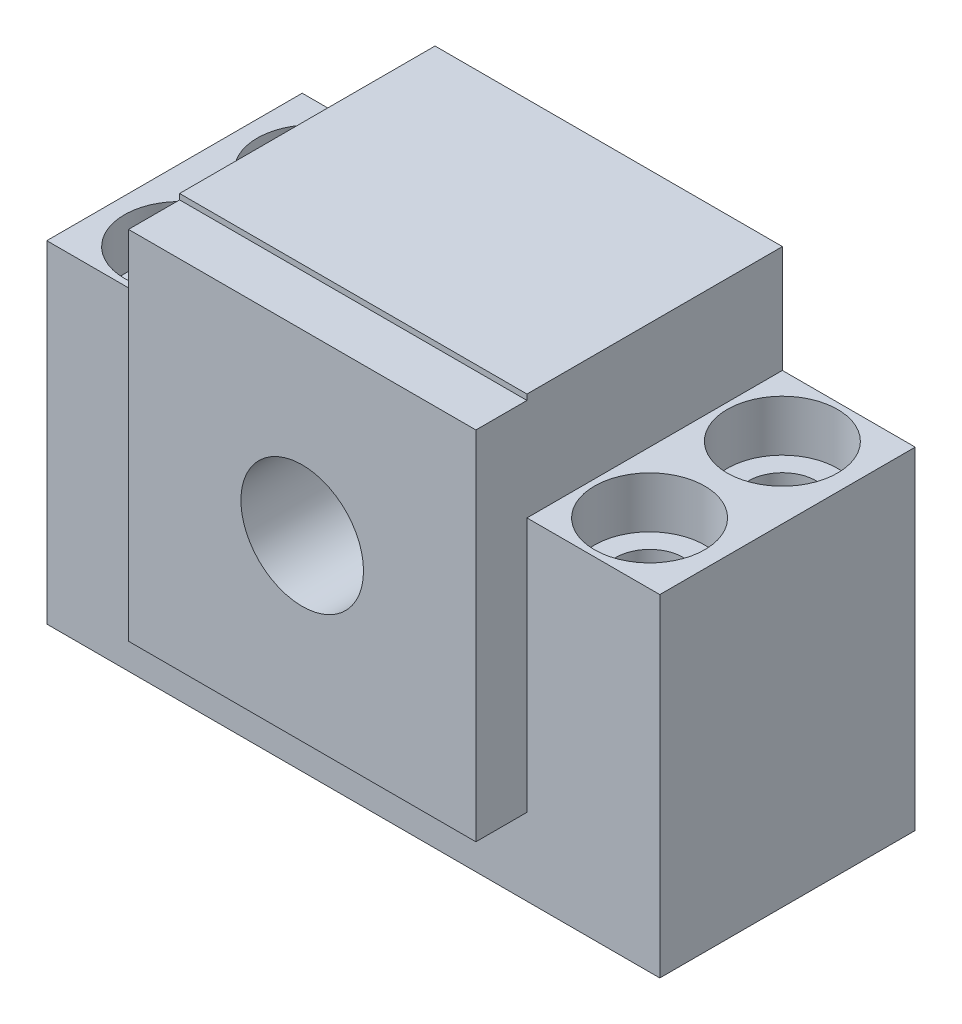
ISO-10303-21;
HEADER;
FILE_DESCRIPTION(('STEP AP214'),'2;1');
FILE_NAME('part.step','',(''),(''),'','','');
FILE_SCHEMA(('AUTOMOTIVE_DESIGN { 1 0 10303 214 1 1 1 1 }'));
ENDSEC;
DATA;
#1=APPLICATION_CONTEXT('core data for automotive mechanical design processes');
#2=APPLICATION_PROTOCOL_DEFINITION('international standard','automotive_design',2000,#1);
#3=PRODUCT_CONTEXT('',#1,'mechanical');
#4=PRODUCT('Part','Part','',(#3));
#5=PRODUCT_RELATED_PRODUCT_CATEGORY('part','',(#4));
#6=PRODUCT_DEFINITION_FORMATION('','',#4);
#7=PRODUCT_DEFINITION_CONTEXT('part definition',#1,'design');
#8=PRODUCT_DEFINITION('design','',#6,#7);
#9=PRODUCT_DEFINITION_SHAPE('','',#8);
#10=(LENGTH_UNIT() NAMED_UNIT(*) SI_UNIT(.MILLI.,.METRE.));
#11=(NAMED_UNIT(*) PLANE_ANGLE_UNIT() SI_UNIT($,.RADIAN.));
#12=(NAMED_UNIT(*) SI_UNIT($,.STERADIAN.) SOLID_ANGLE_UNIT());
#13=UNCERTAINTY_MEASURE_WITH_UNIT(LENGTH_MEASURE(1.E-05),#10,'distance_accuracy_value','');
#14=(GEOMETRIC_REPRESENTATION_CONTEXT(3) GLOBAL_UNCERTAINTY_ASSIGNED_CONTEXT((#13)) GLOBAL_UNIT_ASSIGNED_CONTEXT((#10,
#11,#12)) REPRESENTATION_CONTEXT('',''));
#15=CARTESIAN_POINT('',(0.,0.,0.));
#16=DIRECTION('',(0.,0.,1.));
#17=DIRECTION('',(1.,0.,0.));
#18=AXIS2_PLACEMENT_3D('',#15,#16,#17);
#19=CARTESIAN_POINT('',(0.,0.,25.));
#20=DIRECTION('',(0.,0.,1.));
#21=DIRECTION('',(1.,0.,0.));
#22=AXIS2_PLACEMENT_3D('',#19,#20,#21);
#23=PLANE('',#22);
#24=DIRECTION('',(-1.,0.,0.));
#25=VECTOR('',#24,1.);
#26=CARTESIAN_POINT('',(-14.8619741242739,28.5194279589268,25.));
#27=LINE('',#26,#25);
#28=CARTESIAN_POINT('',(19.1380258757261,28.5194279589268,25.));
#29=VERTEX_POINT('',#28);
#30=CARTESIAN_POINT('',(-14.8619741242739,28.5194279589268,25.));
#31=VERTEX_POINT('',#30);
#32=EDGE_CURVE('E146',#29,#31,#27,.T.);
#33=ORIENTED_EDGE('',*,*,#32,.F.);
#34=DIRECTION('',(0.,1.,0.));
#35=VECTOR('',#34,1.);
#36=CARTESIAN_POINT('',(19.1380258757261,18.5640732265446,25.));
#37=LINE('',#36,#35);
#38=CARTESIAN_POINT('',(19.1380258757261,29.0640732265446,25.));
#39=VERTEX_POINT('',#38);
#40=EDGE_CURVE('E206',#29,#39,#37,.T.);
#41=ORIENTED_EDGE('',*,*,#40,.T.);
#42=DIRECTION('',(-1.,0.,0.));
#43=VECTOR('',#42,1.);
#44=CARTESIAN_POINT('',(19.1380258757261,29.0640732265446,25.));
#45=LINE('',#44,#43);
#46=CARTESIAN_POINT('',(-14.8619741242739,29.0640732265446,25.));
#47=VERTEX_POINT('',#46);
#48=EDGE_CURVE('E208',#39,#47,#45,.T.);
#49=ORIENTED_EDGE('',*,*,#48,.T.);
#50=DIRECTION('',(0.,-1.,0.));
#51=VECTOR('',#50,1.);
#52=CARTESIAN_POINT('',(-14.8619741242739,29.0640732265446,25.));
#53=LINE('',#52,#51);
#54=EDGE_CURVE('E60',#47,#31,#53,.T.);
#55=ORIENTED_EDGE('',*,*,#54,.T.);
#56=EDGE_LOOP('',(#33,#41,#49,#55));
#57=FACE_BOUND('',#56,.T.);
#58=ADVANCED_FACE('F36',(#57),#23,.T.);
#59=CARTESIAN_POINT('',(-20.8619741242739,-13.9369267734554,6.));
#60=DIRECTION('',(0.,1.,0.));
#61=DIRECTION('',(0.,0.,1.));
#62=AXIS2_PLACEMENT_3D('',#59,#60,#61);
#63=CYLINDRICAL_SURFACE('',#62,3.3);
#64=CARTESIAN_POINT('',(-20.8619741242739,-13.9359267734554,6.));
#65=DIRECTION('',(0.,1.,0.));
#66=DIRECTION('',(0.,0.,1.));
#67=AXIS2_PLACEMENT_3D('',#64,#65,#66);
#68=CIRCLE('',#67,3.3);
#69=CARTESIAN_POINT('',(-20.8619741242739,-13.9359267734554,9.3));
#70=VERTEX_POINT('',#69);
#71=EDGE_CURVE('E180',#70,#70,#68,.F.);
#72=ORIENTED_EDGE('',*,*,#71,.T.);
#73=EDGE_LOOP('',(#72));
#74=FACE_BOUND('',#73,.T.);
#75=CARTESIAN_POINT('',(-20.8619741242739,13.5640732265446,6.));
#76=DIRECTION('',(0.,1.,0.));
#77=DIRECTION('',(0.,0.,1.));
#78=AXIS2_PLACEMENT_3D('',#75,#76,#77);
#79=CIRCLE('',#78,3.3);
#80=CARTESIAN_POINT('',(-20.8619741242739,13.5640732265446,9.3));
#81=VERTEX_POINT('',#80);
#82=EDGE_CURVE('E40',#81,#81,#79,.F.);
#83=ORIENTED_EDGE('',*,*,#82,.F.);
#84=EDGE_LOOP('',(#83));
#85=FACE_BOUND('',#84,.T.);
#86=ADVANCED_FACE('F264',(#74,#85),#63,.F.);
#87=CARTESIAN_POINT('',(-20.8619741242739,-13.9369267734554,19.));
#88=DIRECTION('',(0.,1.,0.));
#89=DIRECTION('',(0.,0.,1.));
#90=AXIS2_PLACEMENT_3D('',#87,#88,#89);
#91=CYLINDRICAL_SURFACE('',#90,3.3);
#92=CARTESIAN_POINT('',(-20.8619741242739,-13.9359267734554,19.));
#93=DIRECTION('',(0.,1.,0.));
#94=DIRECTION('',(0.,0.,1.));
#95=AXIS2_PLACEMENT_3D('',#92,#93,#94);
#96=CIRCLE('',#95,3.3);
#97=CARTESIAN_POINT('',(-20.8619741242739,-13.9359267734554,22.3));
#98=VERTEX_POINT('',#97);
#99=EDGE_CURVE('E183',#98,#98,#96,.F.);
#100=ORIENTED_EDGE('',*,*,#99,.T.);
#101=EDGE_LOOP('',(#100));
#102=FACE_BOUND('',#101,.T.);
#103=CARTESIAN_POINT('',(-20.8619741242739,13.5640732265446,19.));
#104=DIRECTION('',(0.,1.,0.));
#105=DIRECTION('',(0.,0.,1.));
#106=AXIS2_PLACEMENT_3D('',#103,#104,#105);
#107=CIRCLE('',#106,3.3);
#108=CARTESIAN_POINT('',(-20.8619741242739,13.5640732265446,22.3));
#109=VERTEX_POINT('',#108);
#110=EDGE_CURVE('E255',#109,#109,#107,.F.);
#111=ORIENTED_EDGE('',*,*,#110,.F.);
#112=EDGE_LOOP('',(#111));
#113=FACE_BOUND('',#112,.T.);
#114=ADVANCED_FACE('F266',(#102,#113),#91,.F.);
#115=CARTESIAN_POINT('',(25.1380258757261,-13.9369267734554,19.));
#116=DIRECTION('',(0.,1.,0.));
#117=DIRECTION('',(0.,0.,1.));
#118=AXIS2_PLACEMENT_3D('',#115,#116,#117);
#119=CYLINDRICAL_SURFACE('',#118,3.3);
#120=CARTESIAN_POINT('',(25.1380258757261,-13.9359267734554,19.));
#121=DIRECTION('',(0.,1.,0.));
#122=DIRECTION('',(0.,0.,1.));
#123=AXIS2_PLACEMENT_3D('',#120,#121,#122);
#124=CIRCLE('',#123,3.3);
#125=CARTESIAN_POINT('',(25.1380258757261,-13.9359267734554,22.3));
#126=VERTEX_POINT('',#125);
#127=EDGE_CURVE('E187',#126,#126,#124,.F.);
#128=ORIENTED_EDGE('',*,*,#127,.T.);
#129=EDGE_LOOP('',(#128));
#130=FACE_BOUND('',#129,.T.);
#131=CARTESIAN_POINT('',(25.1380258757261,13.5640732265446,19.));
#132=DIRECTION('',(0.,1.,0.));
#133=DIRECTION('',(0.,0.,1.));
#134=AXIS2_PLACEMENT_3D('',#131,#132,#133);
#135=CIRCLE('',#134,3.3);
#136=CARTESIAN_POINT('',(25.1380258757261,13.5640732265446,22.3));
#137=VERTEX_POINT('',#136);
#138=EDGE_CURVE('E253',#137,#137,#135,.F.);
#139=ORIENTED_EDGE('',*,*,#138,.F.);
#140=EDGE_LOOP('',(#139));
#141=FACE_BOUND('',#140,.T.);
#142=ADVANCED_FACE('F273',(#130,#141),#119,.F.);
#143=CARTESIAN_POINT('',(25.1380258757261,-13.9369267734554,6.));
#144=DIRECTION('',(0.,1.,0.));
#145=DIRECTION('',(0.,0.,1.));
#146=AXIS2_PLACEMENT_3D('',#143,#144,#145);
#147=CYLINDRICAL_SURFACE('',#146,3.3);
#148=CARTESIAN_POINT('',(25.1380258757261,-13.9359267734554,6.));
#149=DIRECTION('',(0.,1.,0.));
#150=DIRECTION('',(0.,0.,1.));
#151=AXIS2_PLACEMENT_3D('',#148,#149,#150);
#152=CIRCLE('',#151,3.3);
#153=CARTESIAN_POINT('',(25.1380258757261,-13.9359267734554,9.3));
#154=VERTEX_POINT('',#153);
#155=EDGE_CURVE('E184',#154,#154,#152,.F.);
#156=ORIENTED_EDGE('',*,*,#155,.T.);
#157=EDGE_LOOP('',(#156));
#158=FACE_BOUND('',#157,.T.);
#159=CARTESIAN_POINT('',(25.1380258757261,13.5640732265446,6.));
#160=DIRECTION('',(0.,1.,0.));
#161=DIRECTION('',(0.,0.,1.));
#162=AXIS2_PLACEMENT_3D('',#159,#160,#161);
#163=CIRCLE('',#162,3.3);
#164=CARTESIAN_POINT('',(25.1380258757261,13.5640732265446,9.3));
#165=VERTEX_POINT('',#164);
#166=EDGE_CURVE('E177',#165,#165,#163,.F.);
#167=ORIENTED_EDGE('',*,*,#166,.F.);
#168=EDGE_LOOP('',(#167));
#169=FACE_BOUND('',#168,.T.);
#170=ADVANCED_FACE('F282',(#158,#169),#147,.F.);
#171=DIRECTION('',(0.,-1.,0.));
#172=VECTOR('',#171,1.);
#173=CARTESIAN_POINT('',(-14.8619741242739,28.5194279589268,25.));
#174=LINE('',#173,#172);
#175=CARTESIAN_POINT('',(-14.8619741242739,18.5640732265446,25.));
#176=VERTEX_POINT('',#175);
#177=CARTESIAN_POINT('',(-14.8619741242739,-6.39128150583759,25.));
#178=VERTEX_POINT('',#177);
#179=EDGE_CURVE('E11',#176,#178,#174,.T.);
#180=ORIENTED_EDGE('',*,*,#179,.F.);
#181=DIRECTION('',(-1.,0.,0.));
#182=VECTOR('',#181,1.);
#183=CARTESIAN_POINT('',(-14.8619741242739,18.5640732265446,25.));
#184=LINE('',#183,#182);
#185=CARTESIAN_POINT('',(-27.8619741242739,18.5640732265446,25.));
#186=VERTEX_POINT('',#185);
#187=EDGE_CURVE('E211',#176,#186,#184,.T.);
#188=ORIENTED_EDGE('',*,*,#187,.T.);
#189=DIRECTION('',(0.,-1.,0.));
#190=VECTOR('',#189,1.);
#191=CARTESIAN_POINT('',(-27.8619741242739,18.5640732265446,25.));
#192=LINE('',#191,#190);
#193=CARTESIAN_POINT('',(-27.8619741242739,-13.9359267734554,25.));
#194=VERTEX_POINT('',#193);
#195=EDGE_CURVE('E196',#186,#194,#192,.T.);
#196=ORIENTED_EDGE('',*,*,#195,.T.);
#197=DIRECTION('',(1.,0.,0.));
#198=VECTOR('',#197,1.);
#199=CARTESIAN_POINT('',(-27.8619741242739,-13.9359267734554,25.));
#200=LINE('',#199,#198);
#201=CARTESIAN_POINT('',(32.1380258757261,-13.9359267734554,25.));
#202=VERTEX_POINT('',#201);
#203=EDGE_CURVE('E199',#194,#202,#200,.T.);
#204=ORIENTED_EDGE('',*,*,#203,.T.);
#205=DIRECTION('',(0.,1.,0.));
#206=VECTOR('',#205,1.);
#207=CARTESIAN_POINT('',(32.1380258757261,-13.9359267734554,25.));
#208=LINE('',#207,#206);
#209=CARTESIAN_POINT('',(32.1380258757261,18.5640732265446,25.));
#210=VERTEX_POINT('',#209);
#211=EDGE_CURVE('E202',#202,#210,#208,.T.);
#212=ORIENTED_EDGE('',*,*,#211,.T.);
#213=DIRECTION('',(-1.,0.,0.));
#214=VECTOR('',#213,1.);
#215=CARTESIAN_POINT('',(32.1380258757261,18.5640732265446,25.));
#216=LINE('',#215,#214);
#217=CARTESIAN_POINT('',(19.1380258757261,18.5640732265446,25.));
#218=VERTEX_POINT('',#217);
#219=EDGE_CURVE('E204',#210,#218,#216,.T.);
#220=ORIENTED_EDGE('',*,*,#219,.T.);
#221=DIRECTION('',(0.,1.,0.));
#222=VECTOR('',#221,1.);
#223=CARTESIAN_POINT('',(19.1380258757261,28.5194279589268,25.));
#224=LINE('',#223,#222);
#225=CARTESIAN_POINT('',(19.1380258757261,-6.39128150583759,25.));
#226=VERTEX_POINT('',#225);
#227=EDGE_CURVE('E350',#226,#218,#224,.T.);
#228=ORIENTED_EDGE('',*,*,#227,.F.);
#229=DIRECTION('',(1.,0.,0.));
#230=VECTOR('',#229,1.);
#231=CARTESIAN_POINT('',(-14.8619741242739,-6.39128150583759,25.));
#232=LINE('',#231,#230);
#233=EDGE_CURVE('E53',#178,#226,#232,.T.);
#234=ORIENTED_EDGE('',*,*,#233,.F.);
#235=EDGE_LOOP('',(#180,#188,#196,#204,#212,#220,#228,#234));
#236=FACE_BOUND('',#235,.T.);
#237=ADVANCED_FACE('F277',(#236),#23,.T.);
#238=CARTESIAN_POINT('',(0.,0.,0.));
#239=DIRECTION('',(0.,0.,1.));
#240=DIRECTION('',(1.,0.,0.));
#241=AXIS2_PLACEMENT_3D('',#238,#239,#240);
#242=PLANE('',#241);
#243=DIRECTION('',(0.,-1.,0.));
#244=VECTOR('',#243,1.);
#245=CARTESIAN_POINT('',(-27.8619741242739,18.5640732265446,0.));
#246=LINE('',#245,#244);
#247=CARTESIAN_POINT('',(-27.8619741242739,18.5640732265446,0.));
#248=VERTEX_POINT('',#247);
#249=CARTESIAN_POINT('',(-27.8619741242739,-13.9359267734554,0.));
#250=VERTEX_POINT('',#249);
#251=EDGE_CURVE('E195',#248,#250,#246,.T.);
#252=ORIENTED_EDGE('',*,*,#251,.F.);
#253=DIRECTION('',(-1.,0.,0.));
#254=VECTOR('',#253,1.);
#255=CARTESIAN_POINT('',(-14.8619741242739,18.5640732265446,0.));
#256=LINE('',#255,#254);
#257=CARTESIAN_POINT('',(-14.8619741242739,18.5640732265446,0.));
#258=VERTEX_POINT('',#257);
#259=EDGE_CURVE('E200',#258,#248,#256,.T.);
#260=ORIENTED_EDGE('',*,*,#259,.F.);
#261=DIRECTION('',(0.,-1.,0.));
#262=VECTOR('',#261,1.);
#263=CARTESIAN_POINT('',(-14.8619741242739,29.0640732265446,0.));
#264=LINE('',#263,#262);
#265=CARTESIAN_POINT('',(-14.8619741242739,29.0640732265446,0.));
#266=VERTEX_POINT('',#265);
#267=EDGE_CURVE('E226',#266,#258,#264,.T.);
#268=ORIENTED_EDGE('',*,*,#267,.F.);
#269=DIRECTION('',(-1.,0.,0.));
#270=VECTOR('',#269,1.);
#271=CARTESIAN_POINT('',(19.1380258757261,29.0640732265446,0.));
#272=LINE('',#271,#270);
#273=CARTESIAN_POINT('',(19.1380258757261,29.0640732265446,0.));
#274=VERTEX_POINT('',#273);
#275=EDGE_CURVE('E224',#274,#266,#272,.T.);
#276=ORIENTED_EDGE('',*,*,#275,.F.);
#277=DIRECTION('',(0.,1.,0.));
#278=VECTOR('',#277,1.);
#279=CARTESIAN_POINT('',(19.1380258757261,18.5640732265446,0.));
#280=LINE('',#279,#278);
#281=CARTESIAN_POINT('',(19.1380258757261,18.5640732265446,0.));
#282=VERTEX_POINT('',#281);
#283=EDGE_CURVE('E222',#282,#274,#280,.T.);
#284=ORIENTED_EDGE('',*,*,#283,.F.);
#285=DIRECTION('',(-1.,0.,0.));
#286=VECTOR('',#285,1.);
#287=CARTESIAN_POINT('',(32.1380258757261,18.5640732265446,0.));
#288=LINE('',#287,#286);
#289=CARTESIAN_POINT('',(32.1380258757261,18.5640732265446,0.));
#290=VERTEX_POINT('',#289);
#291=EDGE_CURVE('E220',#290,#282,#288,.T.);
#292=ORIENTED_EDGE('',*,*,#291,.F.);
#293=DIRECTION('',(0.,1.,0.));
#294=VECTOR('',#293,1.);
#295=CARTESIAN_POINT('',(32.1380258757261,-13.9359267734554,0.));
#296=LINE('',#295,#294);
#297=CARTESIAN_POINT('',(32.1380258757261,-13.9359267734554,0.));
#298=VERTEX_POINT('',#297);
#299=EDGE_CURVE('E218',#298,#290,#296,.T.);
#300=ORIENTED_EDGE('',*,*,#299,.F.);
#301=DIRECTION('',(1.,0.,0.));
#302=VECTOR('',#301,1.);
#303=CARTESIAN_POINT('',(-27.8619741242739,-13.9359267734554,0.));
#304=LINE('',#303,#302);
#305=EDGE_CURVE('E216',#250,#298,#304,.T.);
#306=ORIENTED_EDGE('',*,*,#305,.F.);
#307=EDGE_LOOP('',(#252,#260,#268,#276,#284,#292,#300,#306));
#308=FACE_BOUND('',#307,.T.);
#309=CARTESIAN_POINT('',(2.13802587572613,11.0640732265446,0.));
#310=DIRECTION('',(0.,0.,1.));
#311=DIRECTION('',(1.,0.,0.));
#312=AXIS2_PLACEMENT_3D('',#309,#310,#311);
#313=CIRCLE('',#312,6.);
#314=CARTESIAN_POINT('',(8.13802587572613,11.0640732265446,0.));
#315=VERTEX_POINT('',#314);
#316=EDGE_CURVE('E192',#315,#315,#313,.T.);
#317=ORIENTED_EDGE('',*,*,#316,.T.);
#318=EDGE_LOOP('',(#317));
#319=FACE_BOUND('',#318,.T.);
#320=ADVANCED_FACE('F296',(#308,#319),#242,.F.);
#321=CARTESIAN_POINT('',(-27.8619741242739,18.5640732265446,25.));
#322=DIRECTION('',(1.,0.,0.));
#323=DIRECTION('',(0.,0.,-1.));
#324=AXIS2_PLACEMENT_3D('',#321,#322,#323);
#325=PLANE('',#324);
#326=ORIENTED_EDGE('',*,*,#251,.T.);
#327=DIRECTION('',(0.,0.,-1.));
#328=VECTOR('',#327,1.);
#329=CARTESIAN_POINT('',(-27.8619741242739,-13.9359267734554,25.));
#330=LINE('',#329,#328);
#331=EDGE_CURVE('E45',#194,#250,#330,.T.);
#332=ORIENTED_EDGE('',*,*,#331,.F.);
#333=ORIENTED_EDGE('',*,*,#195,.F.);
#334=DIRECTION('',(0.,0.,-1.));
#335=VECTOR('',#334,1.);
#336=CARTESIAN_POINT('',(-27.8619741242739,18.5640732265446,25.));
#337=LINE('',#336,#335);
#338=EDGE_CURVE('E213',#186,#248,#337,.T.);
#339=ORIENTED_EDGE('',*,*,#338,.T.);
#340=EDGE_LOOP('',(#326,#332,#333,#339));
#341=FACE_BOUND('',#340,.T.);
#342=ADVANCED_FACE('F38',(#341),#325,.F.);
#343=CARTESIAN_POINT('',(-27.8619741242739,-13.9359267734554,25.));
#344=DIRECTION('',(0.,1.,0.));
#345=DIRECTION('',(0.,0.,1.));
#346=AXIS2_PLACEMENT_3D('',#343,#344,#345);
#347=PLANE('',#346);
#348=ORIENTED_EDGE('',*,*,#155,.F.);
#349=EDGE_LOOP('',(#348));
#350=FACE_BOUND('',#349,.T.);
#351=ORIENTED_EDGE('',*,*,#99,.F.);
#352=EDGE_LOOP('',(#351));
#353=FACE_BOUND('',#352,.T.);
#354=ORIENTED_EDGE('',*,*,#71,.F.);
#355=EDGE_LOOP('',(#354));
#356=FACE_BOUND('',#355,.T.);
#357=ORIENTED_EDGE('',*,*,#127,.F.);
#358=EDGE_LOOP('',(#357));
#359=FACE_BOUND('',#358,.T.);
#360=ORIENTED_EDGE('',*,*,#305,.T.);
#361=DIRECTION('',(0.,0.,-1.));
#362=VECTOR('',#361,1.);
#363=CARTESIAN_POINT('',(32.1380258757261,-13.9359267734554,25.));
#364=LINE('',#363,#362);
#365=EDGE_CURVE('E246',#202,#298,#364,.T.);
#366=ORIENTED_EDGE('',*,*,#365,.F.);
#367=ORIENTED_EDGE('',*,*,#203,.F.);
#368=ORIENTED_EDGE('',*,*,#331,.T.);
#369=EDGE_LOOP('',(#360,#366,#367,#368));
#370=FACE_BOUND('',#369,.T.);
#371=ADVANCED_FACE('F319',(#350,#353,#356,#359,#370),#347,.F.);
#372=CARTESIAN_POINT('',(32.1380258757261,-13.9359267734554,25.));
#373=DIRECTION('',(-1.,0.,0.));
#374=DIRECTION('',(0.,0.,1.));
#375=AXIS2_PLACEMENT_3D('',#372,#373,#374);
#376=PLANE('',#375);
#377=ORIENTED_EDGE('',*,*,#299,.T.);
#378=DIRECTION('',(0.,0.,-1.));
#379=VECTOR('',#378,1.);
#380=CARTESIAN_POINT('',(32.1380258757261,18.5640732265446,25.));
#381=LINE('',#380,#379);
#382=EDGE_CURVE('E243',#210,#290,#381,.T.);
#383=ORIENTED_EDGE('',*,*,#382,.F.);
#384=ORIENTED_EDGE('',*,*,#211,.F.);
#385=ORIENTED_EDGE('',*,*,#365,.T.);
#386=EDGE_LOOP('',(#377,#383,#384,#385));
#387=FACE_BOUND('',#386,.T.);
#388=ADVANCED_FACE('F316',(#387),#376,.F.);
#389=CARTESIAN_POINT('',(32.1380258757261,18.5640732265446,25.));
#390=DIRECTION('',(0.,-1.,0.));
#391=DIRECTION('',(0.,0.,-1.));
#392=AXIS2_PLACEMENT_3D('',#389,#390,#391);
#393=PLANE('',#392);
#394=CARTESIAN_POINT('',(25.1380258757261,18.5640732265446,6.));
#395=DIRECTION('',(0.,1.,0.));
#396=DIRECTION('',(0.,0.,1.));
#397=AXIS2_PLACEMENT_3D('',#394,#395,#396);
#398=CIRCLE('',#397,5.4);
#399=CARTESIAN_POINT('',(25.1380258757261,18.5640732265446,11.4));
#400=VERTEX_POINT('',#399);
#401=EDGE_CURVE('E163',#400,#400,#398,.T.);
#402=ORIENTED_EDGE('',*,*,#401,.F.);
#403=EDGE_LOOP('',(#402));
#404=FACE_BOUND('',#403,.T.);
#405=CARTESIAN_POINT('',(25.1380258757261,18.5640732265446,19.));
#406=DIRECTION('',(0.,1.,0.));
#407=DIRECTION('',(0.,0.,1.));
#408=AXIS2_PLACEMENT_3D('',#405,#406,#407);
#409=CIRCLE('',#408,5.4);
#410=CARTESIAN_POINT('',(25.1380258757261,18.5640732265446,24.4));
#411=VERTEX_POINT('',#410);
#412=EDGE_CURVE('E162',#411,#411,#409,.T.);
#413=ORIENTED_EDGE('',*,*,#412,.F.);
#414=EDGE_LOOP('',(#413));
#415=FACE_BOUND('',#414,.T.);
#416=ORIENTED_EDGE('',*,*,#291,.T.);
#417=DIRECTION('',(0.,0.,-1.));
#418=VECTOR('',#417,1.);
#419=CARTESIAN_POINT('',(19.1380258757261,18.5640732265446,25.));
#420=LINE('',#419,#418);
#421=EDGE_CURVE('E240',#218,#282,#420,.T.);
#422=ORIENTED_EDGE('',*,*,#421,.F.);
#423=ORIENTED_EDGE('',*,*,#219,.F.);
#424=ORIENTED_EDGE('',*,*,#382,.T.);
#425=EDGE_LOOP('',(#416,#422,#423,#424));
#426=FACE_BOUND('',#425,.T.);
#427=ADVANCED_FACE('F312',(#404,#415,#426),#393,.F.);
#428=CARTESIAN_POINT('',(19.1380258757261,18.5640732265446,25.));
#429=DIRECTION('',(-1.,0.,0.));
#430=DIRECTION('',(0.,0.,1.));
#431=AXIS2_PLACEMENT_3D('',#428,#429,#430);
#432=PLANE('',#431);
#433=ORIENTED_EDGE('',*,*,#283,.T.);
#434=DIRECTION('',(0.,0.,-1.));
#435=VECTOR('',#434,1.);
#436=CARTESIAN_POINT('',(19.1380258757261,29.0640732265446,25.));
#437=LINE('',#436,#435);
#438=EDGE_CURVE('E237',#39,#274,#437,.T.);
#439=ORIENTED_EDGE('',*,*,#438,.F.);
#440=ORIENTED_EDGE('',*,*,#40,.F.);
#441=DIRECTION('',(0.,0.,-1.));
#442=VECTOR('',#441,1.);
#443=CARTESIAN_POINT('',(19.1380258757261,28.5194279589268,30.));
#444=LINE('',#443,#442);
#445=CARTESIAN_POINT('',(19.1380258757261,28.5194279589268,30.));
#446=VERTEX_POINT('',#445);
#447=EDGE_CURVE('E155',#446,#29,#444,.T.);
#448=ORIENTED_EDGE('',*,*,#447,.F.);
#449=DIRECTION('',(0.,1.,0.));
#450=VECTOR('',#449,1.);
#451=CARTESIAN_POINT('',(19.1380258757261,28.5194279589268,30.));
#452=LINE('',#451,#450);
#453=CARTESIAN_POINT('',(19.1380258757261,-6.39128150583759,30.));
#454=VERTEX_POINT('',#453);
#455=EDGE_CURVE('E135',#454,#446,#452,.T.);
#456=ORIENTED_EDGE('',*,*,#455,.F.);
#457=DIRECTION('',(0.,0.,-1.));
#458=VECTOR('',#457,1.);
#459=CARTESIAN_POINT('',(19.1380258757261,-6.39128150583759,30.));
#460=LINE('',#459,#458);
#461=EDGE_CURVE('E132',#454,#226,#460,.T.);
#462=ORIENTED_EDGE('',*,*,#461,.T.);
#463=ORIENTED_EDGE('',*,*,#227,.T.);
#464=ORIENTED_EDGE('',*,*,#421,.T.);
#465=EDGE_LOOP('',(#433,#439,#440,#448,#456,#462,#463,#464));
#466=FACE_BOUND('',#465,.T.);
#467=ADVANCED_FACE('F308',(#466),#432,.F.);
#468=CARTESIAN_POINT('',(19.1380258757261,29.0640732265446,25.));
#469=DIRECTION('',(0.,-1.,0.));
#470=DIRECTION('',(0.,0.,-1.));
#471=AXIS2_PLACEMENT_3D('',#468,#469,#470);
#472=PLANE('',#471);
#473=ORIENTED_EDGE('',*,*,#275,.T.);
#474=DIRECTION('',(0.,0.,-1.));
#475=VECTOR('',#474,1.);
#476=CARTESIAN_POINT('',(-14.8619741242739,29.0640732265446,25.));
#477=LINE('',#476,#475);
#478=EDGE_CURVE('E234',#47,#266,#477,.T.);
#479=ORIENTED_EDGE('',*,*,#478,.F.);
#480=ORIENTED_EDGE('',*,*,#48,.F.);
#481=ORIENTED_EDGE('',*,*,#438,.T.);
#482=EDGE_LOOP('',(#473,#479,#480,#481));
#483=FACE_BOUND('',#482,.T.);
#484=ADVANCED_FACE('F305',(#483),#472,.F.);
#485=CARTESIAN_POINT('',(-14.8619741242739,29.0640732265446,25.));
#486=DIRECTION('',(1.,0.,0.));
#487=DIRECTION('',(0.,1.,0.));
#488=AXIS2_PLACEMENT_3D('',#485,#486,#487);
#489=PLANE('',#488);
#490=ORIENTED_EDGE('',*,*,#267,.T.);
#491=DIRECTION('',(0.,0.,-1.));
#492=VECTOR('',#491,1.);
#493=CARTESIAN_POINT('',(-14.8619741242739,18.5640732265446,25.));
#494=LINE('',#493,#492);
#495=EDGE_CURVE('E231',#176,#258,#494,.T.);
#496=ORIENTED_EDGE('',*,*,#495,.F.);
#497=ORIENTED_EDGE('',*,*,#179,.T.);
#498=DIRECTION('',(0.,0.,-1.));
#499=VECTOR('',#498,1.);
#500=CARTESIAN_POINT('',(-14.8619741242739,-6.39128150583759,30.));
#501=LINE('',#500,#499);
#502=CARTESIAN_POINT('',(-14.8619741242739,-6.39128150583759,30.));
#503=VERTEX_POINT('',#502);
#504=EDGE_CURVE('E130',#503,#178,#501,.T.);
#505=ORIENTED_EDGE('',*,*,#504,.F.);
#506=DIRECTION('',(0.,-1.,0.));
#507=VECTOR('',#506,1.);
#508=CARTESIAN_POINT('',(-14.8619741242739,28.5194279589268,30.));
#509=LINE('',#508,#507);
#510=CARTESIAN_POINT('',(-14.8619741242739,28.5194279589268,30.));
#511=VERTEX_POINT('',#510);
#512=EDGE_CURVE('E136',#511,#503,#509,.T.);
#513=ORIENTED_EDGE('',*,*,#512,.F.);
#514=DIRECTION('',(0.,0.,-1.));
#515=VECTOR('',#514,1.);
#516=CARTESIAN_POINT('',(-14.8619741242739,28.5194279589268,30.));
#517=LINE('',#516,#515);
#518=EDGE_CURVE('E356',#511,#31,#517,.T.);
#519=ORIENTED_EDGE('',*,*,#518,.T.);
#520=ORIENTED_EDGE('',*,*,#54,.F.);
#521=ORIENTED_EDGE('',*,*,#478,.T.);
#522=EDGE_LOOP('',(#490,#496,#497,#505,#513,#519,#520,#521));
#523=FACE_BOUND('',#522,.T.);
#524=ADVANCED_FACE('F148',(#523),#489,.F.);
#525=CARTESIAN_POINT('',(-14.8619741242739,18.5640732265446,25.));
#526=DIRECTION('',(0.,-1.,0.));
#527=DIRECTION('',(0.,0.,-1.));
#528=AXIS2_PLACEMENT_3D('',#525,#526,#527);
#529=PLANE('',#528);
#530=CARTESIAN_POINT('',(-20.8619741242739,18.5640732265446,19.));
#531=DIRECTION('',(0.,1.,0.));
#532=DIRECTION('',(0.,0.,1.));
#533=AXIS2_PLACEMENT_3D('',#530,#531,#532);
#534=CIRCLE('',#533,5.4);
#535=CARTESIAN_POINT('',(-20.8619741242739,18.5640732265446,24.4));
#536=VERTEX_POINT('',#535);
#537=EDGE_CURVE('E150',#536,#536,#534,.T.);
#538=ORIENTED_EDGE('',*,*,#537,.F.);
#539=EDGE_LOOP('',(#538));
#540=FACE_BOUND('',#539,.T.);
#541=CARTESIAN_POINT('',(-20.8619741242739,18.5640732265446,6.));
#542=DIRECTION('',(0.,1.,0.));
#543=DIRECTION('',(0.,0.,1.));
#544=AXIS2_PLACEMENT_3D('',#541,#542,#543);
#545=CIRCLE('',#544,5.4);
#546=CARTESIAN_POINT('',(-20.8619741242739,18.5640732265446,11.4));
#547=VERTEX_POINT('',#546);
#548=EDGE_CURVE('E169',#547,#547,#545,.T.);
#549=ORIENTED_EDGE('',*,*,#548,.F.);
#550=EDGE_LOOP('',(#549));
#551=FACE_BOUND('',#550,.T.);
#552=ORIENTED_EDGE('',*,*,#259,.T.);
#553=ORIENTED_EDGE('',*,*,#338,.F.);
#554=ORIENTED_EDGE('',*,*,#187,.F.);
#555=ORIENTED_EDGE('',*,*,#495,.T.);
#556=EDGE_LOOP('',(#552,#553,#554,#555));
#557=FACE_BOUND('',#556,.T.);
#558=ADVANCED_FACE('F292',(#540,#551,#557),#529,.F.);
#559=CARTESIAN_POINT('',(2.13802587572613,11.0640732265446,25.));
#560=DIRECTION('',(0.,0.,-1.));
#561=DIRECTION('',(-1.,0.,0.));
#562=AXIS2_PLACEMENT_3D('',#559,#560,#561);
#563=CYLINDRICAL_SURFACE('',#562,6.);
#564=ORIENTED_EDGE('',*,*,#316,.F.);
#565=EDGE_LOOP('',(#564));
#566=FACE_BOUND('',#565,.T.);
#567=CARTESIAN_POINT('',(2.13802587572613,11.0640732265446,30.));
#568=DIRECTION('',(0.,0.,1.));
#569=DIRECTION('',(1.,0.,0.));
#570=AXIS2_PLACEMENT_3D('',#567,#568,#569);
#571=CIRCLE('',#570,6.);
#572=CARTESIAN_POINT('',(8.13802587572613,11.0640732265446,30.));
#573=VERTEX_POINT('',#572);
#574=EDGE_CURVE('E353',#573,#573,#571,.T.);
#575=ORIENTED_EDGE('',*,*,#574,.T.);
#576=EDGE_LOOP('',(#575));
#577=FACE_BOUND('',#576,.T.);
#578=ADVANCED_FACE('F289',(#566,#577),#563,.F.);
#579=CARTESIAN_POINT('',(25.1380258757261,13.5640732265446,6.));
#580=DIRECTION('',(0.,1.,0.));
#581=DIRECTION('',(0.,0.,1.));
#582=AXIS2_PLACEMENT_3D('',#579,#580,#581);
#583=PLANE('',#582);
#584=CARTESIAN_POINT('',(25.1380258757261,13.5640732265446,6.));
#585=DIRECTION('',(0.,1.,0.));
#586=DIRECTION('',(0.,0.,1.));
#587=AXIS2_PLACEMENT_3D('',#584,#585,#586);
#588=CIRCLE('',#587,5.4);
#589=CARTESIAN_POINT('',(25.1380258757261,13.5640732265446,11.4));
#590=VERTEX_POINT('',#589);
#591=EDGE_CURVE('E159',#590,#590,#588,.T.);
#592=ORIENTED_EDGE('',*,*,#591,.T.);
#593=EDGE_LOOP('',(#592));
#594=FACE_BOUND('',#593,.T.);
#595=ORIENTED_EDGE('',*,*,#166,.T.);
#596=EDGE_LOOP('',(#595));
#597=FACE_BOUND('',#596,.T.);
#598=ADVANCED_FACE('F291',(#594,#597),#583,.T.);
#599=CARTESIAN_POINT('',(25.1380258757261,13.5640732265446,6.));
#600=DIRECTION('',(0.,1.,0.));
#601=DIRECTION('',(0.,0.,1.));
#602=AXIS2_PLACEMENT_3D('',#599,#600,#601);
#603=CYLINDRICAL_SURFACE('',#602,5.4);
#604=ORIENTED_EDGE('',*,*,#591,.F.);
#605=EDGE_LOOP('',(#604));
#606=FACE_BOUND('',#605,.T.);
#607=ORIENTED_EDGE('',*,*,#401,.T.);
#608=EDGE_LOOP('',(#607));
#609=FACE_BOUND('',#608,.T.);
#610=ADVANCED_FACE('F391',(#606,#609),#603,.F.);
#611=CARTESIAN_POINT('',(25.1380258757261,13.5640732265446,19.));
#612=DIRECTION('',(0.,1.,0.));
#613=DIRECTION('',(0.,0.,1.));
#614=AXIS2_PLACEMENT_3D('',#611,#612,#613);
#615=PLANE('',#614);
#616=CARTESIAN_POINT('',(25.1380258757261,13.5640732265446,19.));
#617=DIRECTION('',(0.,1.,0.));
#618=DIRECTION('',(0.,0.,1.));
#619=AXIS2_PLACEMENT_3D('',#616,#617,#618);
#620=CIRCLE('',#619,5.4);
#621=CARTESIAN_POINT('',(25.1380258757261,13.5640732265446,24.4));
#622=VERTEX_POINT('',#621);
#623=EDGE_CURVE('E174',#622,#622,#620,.T.);
#624=ORIENTED_EDGE('',*,*,#623,.T.);
#625=EDGE_LOOP('',(#624));
#626=FACE_BOUND('',#625,.T.);
#627=ORIENTED_EDGE('',*,*,#138,.T.);
#628=EDGE_LOOP('',(#627));
#629=FACE_BOUND('',#628,.T.);
#630=ADVANCED_FACE('F395',(#626,#629),#615,.T.);
#631=CARTESIAN_POINT('',(25.1380258757261,13.5640732265446,19.));
#632=DIRECTION('',(0.,1.,0.));
#633=DIRECTION('',(0.,0.,1.));
#634=AXIS2_PLACEMENT_3D('',#631,#632,#633);
#635=CYLINDRICAL_SURFACE('',#634,5.4);
#636=ORIENTED_EDGE('',*,*,#623,.F.);
#637=EDGE_LOOP('',(#636));
#638=FACE_BOUND('',#637,.T.);
#639=ORIENTED_EDGE('',*,*,#412,.T.);
#640=EDGE_LOOP('',(#639));
#641=FACE_BOUND('',#640,.T.);
#642=ADVANCED_FACE('F280',(#638,#641),#635,.F.);
#643=CARTESIAN_POINT('',(-20.8619741242739,13.5640732265446,19.));
#644=DIRECTION('',(0.,1.,0.));
#645=DIRECTION('',(0.,0.,1.));
#646=AXIS2_PLACEMENT_3D('',#643,#644,#645);
#647=PLANE('',#646);
#648=CARTESIAN_POINT('',(-20.8619741242739,13.5640732265446,19.));
#649=DIRECTION('',(0.,1.,0.));
#650=DIRECTION('',(0.,0.,1.));
#651=AXIS2_PLACEMENT_3D('',#648,#649,#650);
#652=CIRCLE('',#651,5.4);
#653=CARTESIAN_POINT('',(-20.8619741242739,13.5640732265446,24.4));
#654=VERTEX_POINT('',#653);
#655=EDGE_CURVE('E153',#654,#654,#652,.T.);
#656=ORIENTED_EDGE('',*,*,#655,.T.);
#657=EDGE_LOOP('',(#656));
#658=FACE_BOUND('',#657,.T.);
#659=ORIENTED_EDGE('',*,*,#110,.T.);
#660=EDGE_LOOP('',(#659));
#661=FACE_BOUND('',#660,.T.);
#662=ADVANCED_FACE('F401',(#658,#661),#647,.T.);
#663=CARTESIAN_POINT('',(-20.8619741242739,13.5640732265446,19.));
#664=DIRECTION('',(0.,1.,0.));
#665=DIRECTION('',(0.,0.,1.));
#666=AXIS2_PLACEMENT_3D('',#663,#664,#665);
#667=CYLINDRICAL_SURFACE('',#666,5.4);
#668=ORIENTED_EDGE('',*,*,#655,.F.);
#669=EDGE_LOOP('',(#668));
#670=FACE_BOUND('',#669,.T.);
#671=ORIENTED_EDGE('',*,*,#537,.T.);
#672=EDGE_LOOP('',(#671));
#673=FACE_BOUND('',#672,.T.);
#674=ADVANCED_FACE('F398',(#670,#673),#667,.F.);
#675=CARTESIAN_POINT('',(-20.8619741242739,13.5640732265446,6.));
#676=DIRECTION('',(0.,1.,0.));
#677=DIRECTION('',(0.,0.,1.));
#678=AXIS2_PLACEMENT_3D('',#675,#676,#677);
#679=PLANE('',#678);
#680=CARTESIAN_POINT('',(-20.8619741242739,13.5640732265446,6.));
#681=DIRECTION('',(0.,1.,0.));
#682=DIRECTION('',(0.,0.,1.));
#683=AXIS2_PLACEMENT_3D('',#680,#681,#682);
#684=CIRCLE('',#683,5.4);
#685=CARTESIAN_POINT('',(-20.8619741242739,13.5640732265446,11.4));
#686=VERTEX_POINT('',#685);
#687=EDGE_CURVE('E166',#686,#686,#684,.T.);
#688=ORIENTED_EDGE('',*,*,#687,.T.);
#689=EDGE_LOOP('',(#688));
#690=FACE_BOUND('',#689,.T.);
#691=ORIENTED_EDGE('',*,*,#82,.T.);
#692=EDGE_LOOP('',(#691));
#693=FACE_BOUND('',#692,.T.);
#694=ADVANCED_FACE('F262',(#690,#693),#679,.T.);
#695=CARTESIAN_POINT('',(-20.8619741242739,13.5640732265446,6.));
#696=DIRECTION('',(0.,1.,0.));
#697=DIRECTION('',(0.,0.,1.));
#698=AXIS2_PLACEMENT_3D('',#695,#696,#697);
#699=CYLINDRICAL_SURFACE('',#698,5.4);
#700=ORIENTED_EDGE('',*,*,#687,.F.);
#701=EDGE_LOOP('',(#700));
#702=FACE_BOUND('',#701,.T.);
#703=ORIENTED_EDGE('',*,*,#548,.T.);
#704=EDGE_LOOP('',(#703));
#705=FACE_BOUND('',#704,.T.);
#706=ADVANCED_FACE('F377',(#702,#705),#699,.F.);
#707=CARTESIAN_POINT('',(0.,0.,30.));
#708=DIRECTION('',(0.,0.,1.));
#709=DIRECTION('',(1.,0.,0.));
#710=AXIS2_PLACEMENT_3D('',#707,#708,#709);
#711=PLANE('',#710);
#712=ORIENTED_EDGE('',*,*,#512,.T.);
#713=DIRECTION('',(1.,0.,0.));
#714=VECTOR('',#713,1.);
#715=CARTESIAN_POINT('',(-14.8619741242739,-6.39128150583759,30.));
#716=LINE('',#715,#714);
#717=EDGE_CURVE('E126',#503,#454,#716,.T.);
#718=ORIENTED_EDGE('',*,*,#717,.T.);
#719=ORIENTED_EDGE('',*,*,#455,.T.);
#720=DIRECTION('',(-1.,0.,0.));
#721=VECTOR('',#720,1.);
#722=CARTESIAN_POINT('',(-14.8619741242739,28.5194279589268,30.));
#723=LINE('',#722,#721);
#724=EDGE_CURVE('E142',#446,#511,#723,.T.);
#725=ORIENTED_EDGE('',*,*,#724,.T.);
#726=EDGE_LOOP('',(#712,#718,#719,#725));
#727=FACE_BOUND('',#726,.T.);
#728=ORIENTED_EDGE('',*,*,#574,.F.);
#729=EDGE_LOOP('',(#728));
#730=FACE_BOUND('',#729,.T.);
#731=ADVANCED_FACE('F139',(#727,#730),#711,.T.);
#732=CARTESIAN_POINT('',(-14.8619741242739,-6.39128150583759,30.));
#733=DIRECTION('',(0.,1.,0.));
#734=DIRECTION('',(0.,0.,1.));
#735=AXIS2_PLACEMENT_3D('',#732,#733,#734);
#736=PLANE('',#735);
#737=ORIENTED_EDGE('',*,*,#233,.T.);
#738=ORIENTED_EDGE('',*,*,#461,.F.);
#739=ORIENTED_EDGE('',*,*,#717,.F.);
#740=ORIENTED_EDGE('',*,*,#504,.T.);
#741=EDGE_LOOP('',(#737,#738,#739,#740));
#742=FACE_BOUND('',#741,.T.);
#743=ADVANCED_FACE('F128',(#742),#736,.F.);
#744=CARTESIAN_POINT('',(-14.8619741242739,28.5194279589268,30.));
#745=DIRECTION('',(0.,-1.,0.));
#746=DIRECTION('',(0.,0.,-1.));
#747=AXIS2_PLACEMENT_3D('',#744,#745,#746);
#748=PLANE('',#747);
#749=ORIENTED_EDGE('',*,*,#32,.T.);
#750=ORIENTED_EDGE('',*,*,#518,.F.);
#751=ORIENTED_EDGE('',*,*,#724,.F.);
#752=ORIENTED_EDGE('',*,*,#447,.T.);
#753=EDGE_LOOP('',(#749,#750,#751,#752));
#754=FACE_BOUND('',#753,.T.);
#755=ADVANCED_FACE('F360',(#754),#748,.F.);
#756=CLOSED_SHELL('',(#58,#86,#114,#142,#170,#237,#320,#342,#371,#388,#427,#467,#484,#524,#558,
#578,#598,#610,#630,#642,#662,#674,#694,#706,#731,#743,#755));
#757=MANIFOLD_SOLID_BREP('B2',#756);
#758=ADVANCED_BREP_SHAPE_REPRESENTATION('',(#18,#757),#14);
#759=SHAPE_DEFINITION_REPRESENTATION(#9,#758);
ENDSEC;
END-ISO-10303-21;
